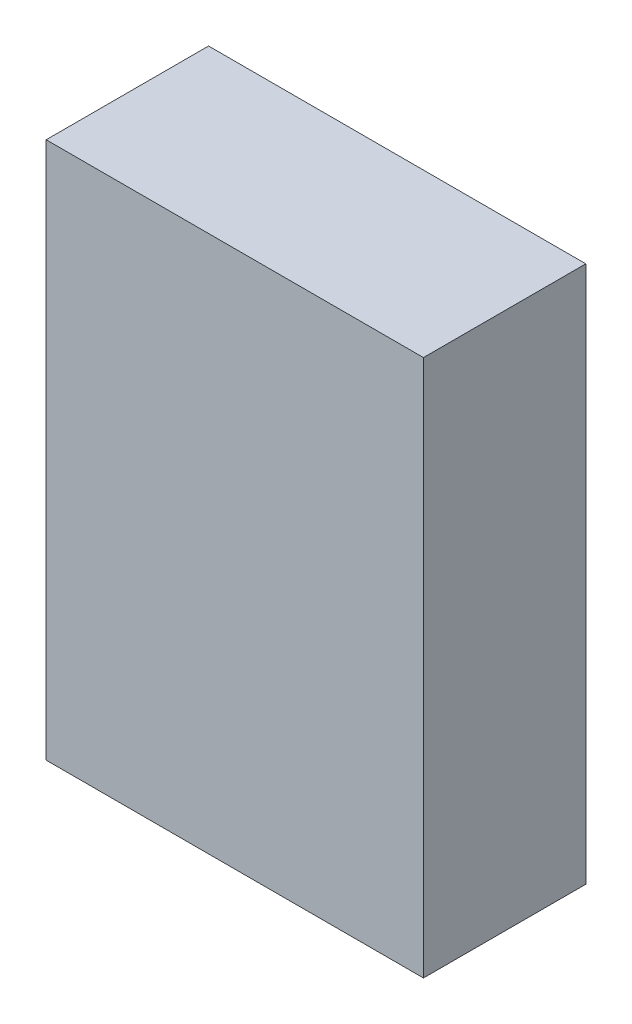
ISO-10303-21;
HEADER;
FILE_DESCRIPTION(('STEP AP214'),'2;1');
FILE_NAME('part.step','',(''),(''),'','','');
FILE_SCHEMA(('AUTOMOTIVE_DESIGN { 1 0 10303 214 1 1 1 1 }'));
ENDSEC;
DATA;
#1=APPLICATION_CONTEXT('core data for automotive mechanical design processes');
#2=APPLICATION_PROTOCOL_DEFINITION('international standard','automotive_design',2000,#1);
#3=PRODUCT_CONTEXT('',#1,'mechanical');
#4=PRODUCT('Part','Part','',(#3));
#5=PRODUCT_RELATED_PRODUCT_CATEGORY('part','',(#4));
#6=PRODUCT_DEFINITION_FORMATION('','',#4);
#7=PRODUCT_DEFINITION_CONTEXT('part definition',#1,'design');
#8=PRODUCT_DEFINITION('design','',#6,#7);
#9=PRODUCT_DEFINITION_SHAPE('','',#8);
#10=(LENGTH_UNIT() NAMED_UNIT(*) SI_UNIT(.MILLI.,.METRE.));
#11=(NAMED_UNIT(*) PLANE_ANGLE_UNIT() SI_UNIT($,.RADIAN.));
#12=(NAMED_UNIT(*) SI_UNIT($,.STERADIAN.) SOLID_ANGLE_UNIT());
#13=UNCERTAINTY_MEASURE_WITH_UNIT(LENGTH_MEASURE(1.E-05),#10,'distance_accuracy_value','');
#14=(GEOMETRIC_REPRESENTATION_CONTEXT(3) GLOBAL_UNCERTAINTY_ASSIGNED_CONTEXT((#13)) GLOBAL_UNIT_ASSIGNED_CONTEXT((#10,
#11,#12)) REPRESENTATION_CONTEXT('',''));
#15=CARTESIAN_POINT('',(0.,0.,0.));
#16=DIRECTION('',(0.,0.,1.));
#17=DIRECTION('',(1.,0.,0.));
#18=AXIS2_PLACEMENT_3D('',#15,#16,#17);
#19=CARTESIAN_POINT('',(-60.1673238434434,-12.6326156160595,2.));
#20=DIRECTION('',(0.,0.,-1.));
#21=DIRECTION('',(-1.,0.,0.));
#22=AXIS2_PLACEMENT_3D('',#19,#20,#21);
#23=CYLINDRICAL_SURFACE('',#22,5.03810723207441);
#24=CARTESIAN_POINT('',(-60.1673238434434,-12.6326156160595,0.));
#25=DIRECTION('',(0.,0.,1.));
#26=DIRECTION('',(1.,0.,0.));
#27=AXIS2_PLACEMENT_3D('',#24,#25,#26);
#28=CIRCLE('',#27,5.03810723207441);
#29=CARTESIAN_POINT('',(-60.1673238434434,-7.59450838398511,0.));
#30=VERTEX_POINT('',#29);
#31=CARTESIAN_POINT('',(-60.1673238434434,-17.6707228481339,0.));
#32=VERTEX_POINT('',#31);
#33=EDGE_CURVE('E145',#30,#32,#28,.T.);
#34=ORIENTED_EDGE('',*,*,#33,.T.);
#35=DIRECTION('',(0.,0.,-1.));
#36=VECTOR('',#35,1.);
#37=CARTESIAN_POINT('',(-60.1673238434434,-17.6707228481339,2.));
#38=LINE('',#37,#36);
#39=CARTESIAN_POINT('',(-60.1673238434434,-17.6707228481339,2.));
#40=VERTEX_POINT('',#39);
#41=EDGE_CURVE('E120',#40,#32,#38,.T.);
#42=ORIENTED_EDGE('',*,*,#41,.F.);
#43=CARTESIAN_POINT('',(-60.1673238434434,-12.6326156160595,2.));
#44=DIRECTION('',(0.,0.,1.));
#45=DIRECTION('',(1.,0.,0.));
#46=AXIS2_PLACEMENT_3D('',#43,#44,#45);
#47=CIRCLE('',#46,5.03810723207441);
#48=CARTESIAN_POINT('',(-60.1673238434434,-7.5945083839851,2.));
#49=VERTEX_POINT('',#48);
#50=EDGE_CURVE('E116',#49,#40,#47,.T.);
#51=ORIENTED_EDGE('',*,*,#50,.F.);
#52=DIRECTION('',(0.,0.,-1.));
#53=VECTOR('',#52,1.);
#54=CARTESIAN_POINT('',(-60.1673238434434,-7.59450838398511,2.));
#55=LINE('',#54,#53);
#56=EDGE_CURVE('E43',#49,#30,#55,.T.);
#57=ORIENTED_EDGE('',*,*,#56,.T.);
#58=EDGE_LOOP('',(#34,#42,#51,#57));
#59=FACE_BOUND('',#58,.T.);
#60=ADVANCED_FACE('F39',(#59),#23,.T.);
#61=CARTESIAN_POINT('',(-60.1673238434434,0.,2.));
#62=DIRECTION('',(-1.,0.,0.));
#63=DIRECTION('',(0.,0.,1.));
#64=AXIS2_PLACEMENT_3D('',#61,#62,#63);
#65=PLANE('',#64);
#66=DIRECTION('',(0.,1.,0.));
#67=VECTOR('',#66,1.);
#68=CARTESIAN_POINT('',(-60.1673238434434,0.,0.));
#69=LINE('',#68,#67);
#70=CARTESIAN_POINT('',(-60.1673238434434,-27.5228247692376,0.));
#71=VERTEX_POINT('',#70);
#72=EDGE_CURVE('E147',#71,#32,#69,.T.);
#73=ORIENTED_EDGE('',*,*,#72,.F.);
#74=DIRECTION('',(0.,0.,-1.));
#75=VECTOR('',#74,1.);
#76=CARTESIAN_POINT('',(-60.1673238434434,-27.5228247692376,2.));
#77=LINE('',#76,#75);
#78=CARTESIAN_POINT('',(-60.1673238434434,-27.5228247692376,9.));
#79=VERTEX_POINT('',#78);
#80=EDGE_CURVE('E119',#79,#71,#77,.T.);
#81=ORIENTED_EDGE('',*,*,#80,.F.);
#82=DIRECTION('',(0.,-1.,0.));
#83=VECTOR('',#82,1.);
#84=CARTESIAN_POINT('',(-60.1673238434434,2.25759353711855,9.));
#85=LINE('',#84,#83);
#86=CARTESIAN_POINT('',(-60.1673238434434,2.25759353711855,9.));
#87=VERTEX_POINT('',#86);
#88=EDGE_CURVE('E133',#87,#79,#85,.T.);
#89=ORIENTED_EDGE('',*,*,#88,.F.);
#90=DIRECTION('',(0.,0.,-1.));
#91=VECTOR('',#90,1.);
#92=CARTESIAN_POINT('',(-60.1673238434434,2.25759353711855,2.));
#93=LINE('',#92,#91);
#94=CARTESIAN_POINT('',(-60.1673238434434,2.25759353711855,0.));
#95=VERTEX_POINT('',#94);
#96=EDGE_CURVE('E93',#87,#95,#93,.T.);
#97=ORIENTED_EDGE('',*,*,#96,.T.);
#98=EDGE_CURVE('E108',#30,#95,#69,.T.);
#99=ORIENTED_EDGE('',*,*,#98,.F.);
#100=ORIENTED_EDGE('',*,*,#56,.F.);
#101=DIRECTION('',(0.,-1.,0.));
#102=VECTOR('',#101,1.);
#103=CARTESIAN_POINT('',(-60.1673238434434,2.25759353711855,2.));
#104=LINE('',#103,#102);
#105=CARTESIAN_POINT('',(-60.1673238434434,-8.8926301122222,2.));
#106=VERTEX_POINT('',#105);
#107=EDGE_CURVE('E11',#49,#106,#104,.T.);
#108=ORIENTED_EDGE('',*,*,#107,.T.);
#109=CARTESIAN_POINT('',(-60.1673238434434,-16.3726011198968,2.));
#110=VERTEX_POINT('',#109);
#111=EDGE_CURVE('E51',#106,#110,#104,.T.);
#112=ORIENTED_EDGE('',*,*,#111,.T.);
#113=EDGE_CURVE('E49',#110,#40,#104,.T.);
#114=ORIENTED_EDGE('',*,*,#113,.T.);
#115=ORIENTED_EDGE('',*,*,#41,.T.);
#116=EDGE_LOOP('',(#73,#81,#89,#97,#99,#100,#108,#112,#114,#115));
#117=FACE_BOUND('',#116,.T.);
#118=ADVANCED_FACE('F153',(#117),#65,.T.);
#119=CARTESIAN_POINT('',(0.,-27.5228247692376,2.));
#120=DIRECTION('',(0.,1.,0.));
#121=DIRECTION('',(0.,0.,1.));
#122=AXIS2_PLACEMENT_3D('',#119,#120,#121);
#123=PLANE('',#122);
#124=DIRECTION('',(1.,0.,0.));
#125=VECTOR('',#124,1.);
#126=CARTESIAN_POINT('',(0.,-27.5228247692376,0.));
#127=LINE('',#126,#125);
#128=CARTESIAN_POINT('',(-39.2577849429894,-27.5228247692376,0.));
#129=VERTEX_POINT('',#128);
#130=EDGE_CURVE('E102',#71,#129,#127,.T.);
#131=ORIENTED_EDGE('',*,*,#130,.T.);
#132=DIRECTION('',(0.,0.,-1.));
#133=VECTOR('',#132,1.);
#134=CARTESIAN_POINT('',(-39.2577849429894,-27.5228247692376,2.));
#135=LINE('',#134,#133);
#136=CARTESIAN_POINT('',(-39.2577849429894,-27.5228247692376,9.));
#137=VERTEX_POINT('',#136);
#138=EDGE_CURVE('E92',#137,#129,#135,.T.);
#139=ORIENTED_EDGE('',*,*,#138,.F.);
#140=DIRECTION('',(1.,0.,0.));
#141=VECTOR('',#140,1.);
#142=CARTESIAN_POINT('',(-39.2577849429894,-27.5228247692376,9.));
#143=LINE('',#142,#141);
#144=EDGE_CURVE('E137',#79,#137,#143,.T.);
#145=ORIENTED_EDGE('',*,*,#144,.F.);
#146=ORIENTED_EDGE('',*,*,#80,.T.);
#147=EDGE_LOOP('',(#131,#139,#145,#146));
#148=FACE_BOUND('',#147,.T.);
#149=ADVANCED_FACE('F159',(#148),#123,.F.);
#150=CARTESIAN_POINT('',(-39.2577849429894,0.,2.));
#151=DIRECTION('',(-1.,0.,0.));
#152=DIRECTION('',(0.,0.,1.));
#153=AXIS2_PLACEMENT_3D('',#150,#151,#152);
#154=PLANE('',#153);
#155=DIRECTION('',(0.,1.,0.));
#156=VECTOR('',#155,1.);
#157=CARTESIAN_POINT('',(-39.2577849429894,0.,0.));
#158=LINE('',#157,#156);
#159=CARTESIAN_POINT('',(-39.2577849429894,2.25759353711855,0.));
#160=VERTEX_POINT('',#159);
#161=EDGE_CURVE('E96',#129,#160,#158,.T.);
#162=ORIENTED_EDGE('',*,*,#161,.T.);
#163=DIRECTION('',(0.,0.,-1.));
#164=VECTOR('',#163,1.);
#165=CARTESIAN_POINT('',(-39.2577849429894,2.25759353711855,2.));
#166=LINE('',#165,#164);
#167=CARTESIAN_POINT('',(-39.2577849429894,2.25759353711855,9.));
#168=VERTEX_POINT('',#167);
#169=EDGE_CURVE('E80',#168,#160,#166,.T.);
#170=ORIENTED_EDGE('',*,*,#169,.F.);
#171=DIRECTION('',(0.,1.,0.));
#172=VECTOR('',#171,1.);
#173=CARTESIAN_POINT('',(-39.2577849429894,2.25759353711855,9.));
#174=LINE('',#173,#172);
#175=EDGE_CURVE('E128',#137,#168,#174,.T.);
#176=ORIENTED_EDGE('',*,*,#175,.F.);
#177=ORIENTED_EDGE('',*,*,#138,.T.);
#178=EDGE_LOOP('',(#162,#170,#176,#177));
#179=FACE_BOUND('',#178,.T.);
#180=ADVANCED_FACE('F97',(#179),#154,.F.);
#181=CARTESIAN_POINT('',(-60.1673238434434,-12.6326156160595,2.));
#182=DIRECTION('',(0.,0.,-1.));
#183=DIRECTION('',(-1.,0.,0.));
#184=AXIS2_PLACEMENT_3D('',#181,#182,#183);
#185=CYLINDRICAL_SURFACE('',#184,3.73998550383732);
#186=CARTESIAN_POINT('',(-60.1673238434434,-12.6326156160595,2.));
#187=DIRECTION('',(0.,0.,1.));
#188=DIRECTION('',(1.,0.,0.));
#189=AXIS2_PLACEMENT_3D('',#186,#187,#188);
#190=CIRCLE('',#189,3.73998550383732);
#191=EDGE_CURVE('E112',#106,#110,#190,.T.);
#192=ORIENTED_EDGE('',*,*,#191,.T.);
#193=EDGE_CURVE('E109',#110,#106,#190,.T.);
#194=ORIENTED_EDGE('',*,*,#193,.T.);
#195=EDGE_LOOP('',(#192,#194));
#196=FACE_BOUND('',#195,.T.);
#197=CARTESIAN_POINT('',(-60.1673238434434,-12.6326156160595,0.));
#198=DIRECTION('',(0.,0.,1.));
#199=DIRECTION('',(1.,0.,0.));
#200=AXIS2_PLACEMENT_3D('',#197,#198,#199);
#201=CIRCLE('',#200,3.73998550383732);
#202=CARTESIAN_POINT('',(-56.4273383396061,-12.6326156160595,0.));
#203=VERTEX_POINT('',#202);
#204=EDGE_CURVE('E138',#203,#203,#201,.T.);
#205=ORIENTED_EDGE('',*,*,#204,.F.);
#206=EDGE_LOOP('',(#205));
#207=FACE_BOUND('',#206,.T.);
#208=ADVANCED_FACE('F41',(#196,#207),#185,.F.);
#209=CARTESIAN_POINT('',(0.,2.25759353711855,2.));
#210=DIRECTION('',(0.,1.,0.));
#211=DIRECTION('',(0.,0.,1.));
#212=AXIS2_PLACEMENT_3D('',#209,#210,#211);
#213=PLANE('',#212);
#214=DIRECTION('',(1.,0.,0.));
#215=VECTOR('',#214,1.);
#216=CARTESIAN_POINT('',(0.,2.25759353711855,0.));
#217=LINE('',#216,#215);
#218=EDGE_CURVE('E85',#95,#160,#217,.T.);
#219=ORIENTED_EDGE('',*,*,#218,.F.);
#220=ORIENTED_EDGE('',*,*,#96,.F.);
#221=DIRECTION('',(-1.,0.,0.));
#222=VECTOR('',#221,1.);
#223=CARTESIAN_POINT('',(-39.2577849429894,2.25759353711855,9.));
#224=LINE('',#223,#222);
#225=EDGE_CURVE('E88',#168,#87,#224,.T.);
#226=ORIENTED_EDGE('',*,*,#225,.F.);
#227=ORIENTED_EDGE('',*,*,#169,.T.);
#228=EDGE_LOOP('',(#219,#220,#226,#227));
#229=FACE_BOUND('',#228,.T.);
#230=ADVANCED_FACE('F82',(#229),#213,.T.);
#231=CARTESIAN_POINT('',(0.,0.,2.));
#232=DIRECTION('',(0.,0.,1.));
#233=DIRECTION('',(1.,0.,0.));
#234=AXIS2_PLACEMENT_3D('',#231,#232,#233);
#235=PLANE('',#234);
#236=ORIENTED_EDGE('',*,*,#107,.F.);
#237=ORIENTED_EDGE('',*,*,#50,.T.);
#238=ORIENTED_EDGE('',*,*,#113,.F.);
#239=ORIENTED_EDGE('',*,*,#191,.F.);
#240=EDGE_LOOP('',(#236,#237,#238,#239));
#241=FACE_BOUND('',#240,.T.);
#242=ADVANCED_FACE('F174',(#241),#235,.T.);
#243=CARTESIAN_POINT('',(0.,0.,0.));
#244=DIRECTION('',(0.,0.,1.));
#245=DIRECTION('',(1.,0.,0.));
#246=AXIS2_PLACEMENT_3D('',#243,#244,#245);
#247=PLANE('',#246);
#248=ORIENTED_EDGE('',*,*,#204,.T.);
#249=EDGE_LOOP('',(#248));
#250=FACE_BOUND('',#249,.T.);
#251=ORIENTED_EDGE('',*,*,#98,.T.);
#252=ORIENTED_EDGE('',*,*,#218,.T.);
#253=ORIENTED_EDGE('',*,*,#161,.F.);
#254=ORIENTED_EDGE('',*,*,#130,.F.);
#255=ORIENTED_EDGE('',*,*,#72,.T.);
#256=ORIENTED_EDGE('',*,*,#33,.F.);
#257=EDGE_LOOP('',(#251,#252,#253,#254,#255,#256));
#258=FACE_BOUND('',#257,.T.);
#259=ADVANCED_FACE('F105',(#250,#258),#247,.F.);
#260=CARTESIAN_POINT('',(0.,0.,2.));
#261=DIRECTION('',(0.,0.,-1.));
#262=DIRECTION('',(-1.,0.,0.));
#263=AXIS2_PLACEMENT_3D('',#260,#261,#262);
#264=PLANE('',#263);
#265=ORIENTED_EDGE('',*,*,#193,.F.);
#266=ORIENTED_EDGE('',*,*,#111,.F.);
#267=EDGE_LOOP('',(#265,#266));
#268=FACE_BOUND('',#267,.T.);
#269=ADVANCED_FACE('F168',(#268),#264,.T.);
#270=CARTESIAN_POINT('',(0.,0.,9.));
#271=DIRECTION('',(0.,0.,-1.));
#272=DIRECTION('',(-1.,0.,0.));
#273=AXIS2_PLACEMENT_3D('',#270,#271,#272);
#274=PLANE('',#273);
#275=ORIENTED_EDGE('',*,*,#175,.T.);
#276=ORIENTED_EDGE('',*,*,#225,.T.);
#277=ORIENTED_EDGE('',*,*,#88,.T.);
#278=ORIENTED_EDGE('',*,*,#144,.T.);
#279=EDGE_LOOP('',(#275,#276,#277,#278));
#280=FACE_BOUND('',#279,.T.);
#281=ADVANCED_FACE('F158',(#280),#274,.F.);
#282=CLOSED_SHELL('',(#60,#118,#149,#180,#208,#230,#242,#259,#269,#281));
#283=MANIFOLD_SOLID_BREP('B2',#282);
#284=ADVANCED_BREP_SHAPE_REPRESENTATION('',(#18,#283),#14);
#285=SHAPE_DEFINITION_REPRESENTATION(#9,#284);
ENDSEC;
END-ISO-10303-21;
